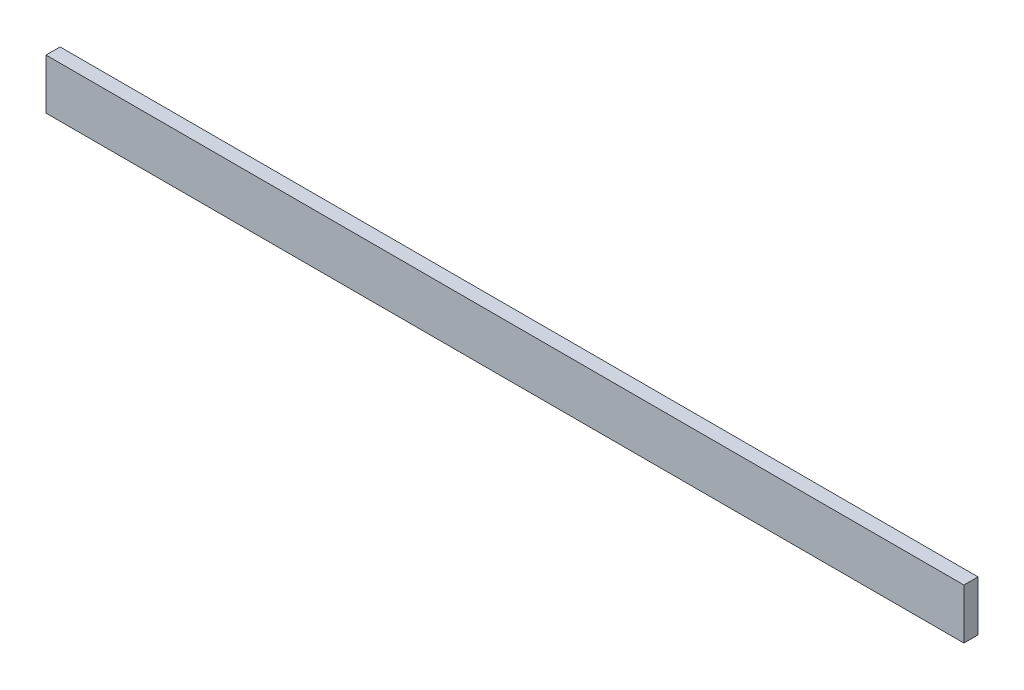
ISO-10303-21;
HEADER;
FILE_DESCRIPTION(('STEP AP214'),'2;1');
FILE_NAME('part.step','',(''),(''),'','','');
FILE_SCHEMA(('AUTOMOTIVE_DESIGN { 1 0 10303 214 1 1 1 1 }'));
ENDSEC;
DATA;
#1=APPLICATION_CONTEXT('core data for automotive mechanical design processes');
#2=APPLICATION_PROTOCOL_DEFINITION('international standard','automotive_design',2000,#1);
#3=PRODUCT_CONTEXT('',#1,'mechanical');
#4=PRODUCT('Part','Part','',(#3));
#5=PRODUCT_RELATED_PRODUCT_CATEGORY('part','',(#4));
#6=PRODUCT_DEFINITION_FORMATION('','',#4);
#7=PRODUCT_DEFINITION_CONTEXT('part definition',#1,'design');
#8=PRODUCT_DEFINITION('design','',#6,#7);
#9=PRODUCT_DEFINITION_SHAPE('','',#8);
#10=(LENGTH_UNIT() NAMED_UNIT(*) SI_UNIT(.MILLI.,.METRE.));
#11=(NAMED_UNIT(*) PLANE_ANGLE_UNIT() SI_UNIT($,.RADIAN.));
#12=(NAMED_UNIT(*) SI_UNIT($,.STERADIAN.) SOLID_ANGLE_UNIT());
#13=UNCERTAINTY_MEASURE_WITH_UNIT(LENGTH_MEASURE(1.E-05),#10,'distance_accuracy_value','');
#14=(GEOMETRIC_REPRESENTATION_CONTEXT(3) GLOBAL_UNCERTAINTY_ASSIGNED_CONTEXT((#13)) GLOBAL_UNIT_ASSIGNED_CONTEXT((#10,
#11,#12)) REPRESENTATION_CONTEXT('',''));
#15=CARTESIAN_POINT('',(0.,0.,0.));
#16=DIRECTION('',(0.,0.,1.));
#17=DIRECTION('',(1.,0.,0.));
#18=AXIS2_PLACEMENT_3D('',#15,#16,#17);
#19=CARTESIAN_POINT('',(0.,0.,7.112));
#20=DIRECTION('',(0.,1.,0.));
#21=DIRECTION('',(0.,0.,1.));
#22=AXIS2_PLACEMENT_3D('',#19,#20,#21);
#23=PLANE('',#22);
#24=DIRECTION('',(0.,0.,-1.));
#25=VECTOR('',#24,1.);
#26=CARTESIAN_POINT('',(25.4,0.,7.112));
#27=LINE('',#26,#25);
#28=CARTESIAN_POINT('',(25.4,0.,7.112));
#29=VERTEX_POINT('',#28);
#30=CARTESIAN_POINT('',(25.4,0.,0.));
#31=VERTEX_POINT('',#30);
#32=EDGE_CURVE('E96',#29,#31,#27,.T.);
#33=ORIENTED_EDGE('',*,*,#32,.T.);
#34=DIRECTION('',(1.,0.,0.));
#35=VECTOR('',#34,1.);
#36=CARTESIAN_POINT('',(0.,0.,0.));
#37=LINE('',#36,#35);
#38=CARTESIAN_POINT('',(488.95,0.,0.));
#39=VERTEX_POINT('',#38);
#40=EDGE_CURVE('E83',#31,#39,#37,.T.);
#41=ORIENTED_EDGE('',*,*,#40,.T.);
#42=DIRECTION('',(0.,0.,-1.));
#43=VECTOR('',#42,1.);
#44=CARTESIAN_POINT('',(488.95,0.,7.112));
#45=LINE('',#44,#43);
#46=CARTESIAN_POINT('',(488.95,0.,7.112));
#47=VERTEX_POINT('',#46);
#48=EDGE_CURVE('E11',#47,#39,#45,.T.);
#49=ORIENTED_EDGE('',*,*,#48,.F.);
#50=DIRECTION('',(1.,0.,0.));
#51=VECTOR('',#50,1.);
#52=CARTESIAN_POINT('',(0.,0.,7.112));
#53=LINE('',#52,#51);
#54=EDGE_CURVE('E91',#29,#47,#53,.T.);
#55=ORIENTED_EDGE('',*,*,#54,.F.);
#56=EDGE_LOOP('',(#33,#41,#49,#55));
#57=FACE_BOUND('',#56,.T.);
#58=ADVANCED_FACE('F39',(#57),#23,.F.);
#59=CARTESIAN_POINT('',(0.,25.4,7.112));
#60=DIRECTION('',(0.,-1.,0.));
#61=DIRECTION('',(0.,0.,-1.));
#62=AXIS2_PLACEMENT_3D('',#59,#60,#61);
#63=PLANE('',#62);
#64=DIRECTION('',(0.,0.,-1.));
#65=VECTOR('',#64,1.);
#66=CARTESIAN_POINT('',(25.4,25.4,7.112));
#67=LINE('',#66,#65);
#68=CARTESIAN_POINT('',(25.4,25.4,7.112));
#69=VERTEX_POINT('',#68);
#70=CARTESIAN_POINT('',(25.4,25.4,0.));
#71=VERTEX_POINT('',#70);
#72=EDGE_CURVE('E53',#69,#71,#67,.T.);
#73=ORIENTED_EDGE('',*,*,#72,.F.);
#74=DIRECTION('',(-1.,0.,0.));
#75=VECTOR('',#74,1.);
#76=CARTESIAN_POINT('',(0.,25.4,7.112));
#77=LINE('',#76,#75);
#78=CARTESIAN_POINT('',(488.95,25.4,7.112));
#79=VERTEX_POINT('',#78);
#80=EDGE_CURVE('E88',#79,#69,#77,.T.);
#81=ORIENTED_EDGE('',*,*,#80,.F.);
#82=DIRECTION('',(0.,0.,-1.));
#83=VECTOR('',#82,1.);
#84=CARTESIAN_POINT('',(488.95,25.4,7.112));
#85=LINE('',#84,#83);
#86=CARTESIAN_POINT('',(488.95,25.4,0.));
#87=VERTEX_POINT('',#86);
#88=EDGE_CURVE('E46',#79,#87,#85,.T.);
#89=ORIENTED_EDGE('',*,*,#88,.T.);
#90=DIRECTION('',(-1.,0.,0.));
#91=VECTOR('',#90,1.);
#92=CARTESIAN_POINT('',(0.,25.4,0.));
#93=LINE('',#92,#91);
#94=EDGE_CURVE('E82',#87,#71,#93,.T.);
#95=ORIENTED_EDGE('',*,*,#94,.T.);
#96=EDGE_LOOP('',(#73,#81,#89,#95));
#97=FACE_BOUND('',#96,.T.);
#98=ADVANCED_FACE('F87',(#97),#63,.F.);
#99=CARTESIAN_POINT('',(0.,0.,7.112));
#100=DIRECTION('',(0.,0.,-1.));
#101=DIRECTION('',(-1.,0.,0.));
#102=AXIS2_PLACEMENT_3D('',#99,#100,#101);
#103=PLANE('',#102);
#104=DIRECTION('',(0.,1.,0.));
#105=VECTOR('',#104,1.);
#106=CARTESIAN_POINT('',(25.4,0.,7.112));
#107=LINE('',#106,#105);
#108=EDGE_CURVE('E102',#29,#69,#107,.T.);
#109=ORIENTED_EDGE('',*,*,#108,.F.);
#110=ORIENTED_EDGE('',*,*,#54,.T.);
#111=DIRECTION('',(0.,1.,0.));
#112=VECTOR('',#111,1.);
#113=CARTESIAN_POINT('',(488.95,0.,7.112));
#114=LINE('',#113,#112);
#115=EDGE_CURVE('E62',#47,#79,#114,.T.);
#116=ORIENTED_EDGE('',*,*,#115,.T.);
#117=ORIENTED_EDGE('',*,*,#80,.T.);
#118=EDGE_LOOP('',(#109,#110,#116,#117));
#119=FACE_BOUND('',#118,.T.);
#120=ADVANCED_FACE('F110',(#119),#103,.F.);
#121=CARTESIAN_POINT('',(0.,0.,0.));
#122=DIRECTION('',(0.,0.,-1.));
#123=DIRECTION('',(-1.,0.,0.));
#124=AXIS2_PLACEMENT_3D('',#121,#122,#123);
#125=PLANE('',#124);
#126=ORIENTED_EDGE('',*,*,#40,.F.);
#127=DIRECTION('',(0.,1.,0.));
#128=VECTOR('',#127,1.);
#129=CARTESIAN_POINT('',(25.4,0.,0.));
#130=LINE('',#129,#128);
#131=EDGE_CURVE('E90',#31,#71,#130,.T.);
#132=ORIENTED_EDGE('',*,*,#131,.T.);
#133=ORIENTED_EDGE('',*,*,#94,.F.);
#134=DIRECTION('',(0.,1.,0.));
#135=VECTOR('',#134,1.);
#136=CARTESIAN_POINT('',(488.95,0.,0.));
#137=LINE('',#136,#135);
#138=EDGE_CURVE('E74',#39,#87,#137,.T.);
#139=ORIENTED_EDGE('',*,*,#138,.F.);
#140=EDGE_LOOP('',(#126,#132,#133,#139));
#141=FACE_BOUND('',#140,.T.);
#142=ADVANCED_FACE('F89',(#141),#125,.T.);
#143=CARTESIAN_POINT('',(488.95,0.,7.112));
#144=DIRECTION('',(-1.,0.,0.));
#145=DIRECTION('',(0.,0.,1.));
#146=AXIS2_PLACEMENT_3D('',#143,#144,#145);
#147=PLANE('',#146);
#148=ORIENTED_EDGE('',*,*,#138,.T.);
#149=ORIENTED_EDGE('',*,*,#88,.F.);
#150=ORIENTED_EDGE('',*,*,#115,.F.);
#151=ORIENTED_EDGE('',*,*,#48,.T.);
#152=EDGE_LOOP('',(#148,#149,#150,#151));
#153=FACE_BOUND('',#152,.T.);
#154=ADVANCED_FACE('F76',(#153),#147,.F.);
#155=CARTESIAN_POINT('',(25.4,0.,7.112));
#156=DIRECTION('',(-1.,0.,0.));
#157=DIRECTION('',(0.,0.,1.));
#158=AXIS2_PLACEMENT_3D('',#155,#156,#157);
#159=PLANE('',#158);
#160=ORIENTED_EDGE('',*,*,#131,.F.);
#161=ORIENTED_EDGE('',*,*,#32,.F.);
#162=ORIENTED_EDGE('',*,*,#108,.T.);
#163=ORIENTED_EDGE('',*,*,#72,.T.);
#164=EDGE_LOOP('',(#160,#161,#162,#163));
#165=FACE_BOUND('',#164,.T.);
#166=ADVANCED_FACE('F106',(#165),#159,.T.);
#167=CLOSED_SHELL('',(#58,#98,#120,#142,#154,#166));
#168=MANIFOLD_SOLID_BREP('B2',#167);
#169=ADVANCED_BREP_SHAPE_REPRESENTATION('',(#18,#168),#14);
#170=SHAPE_DEFINITION_REPRESENTATION(#9,#169);
ENDSEC;
END-ISO-10303-21;
